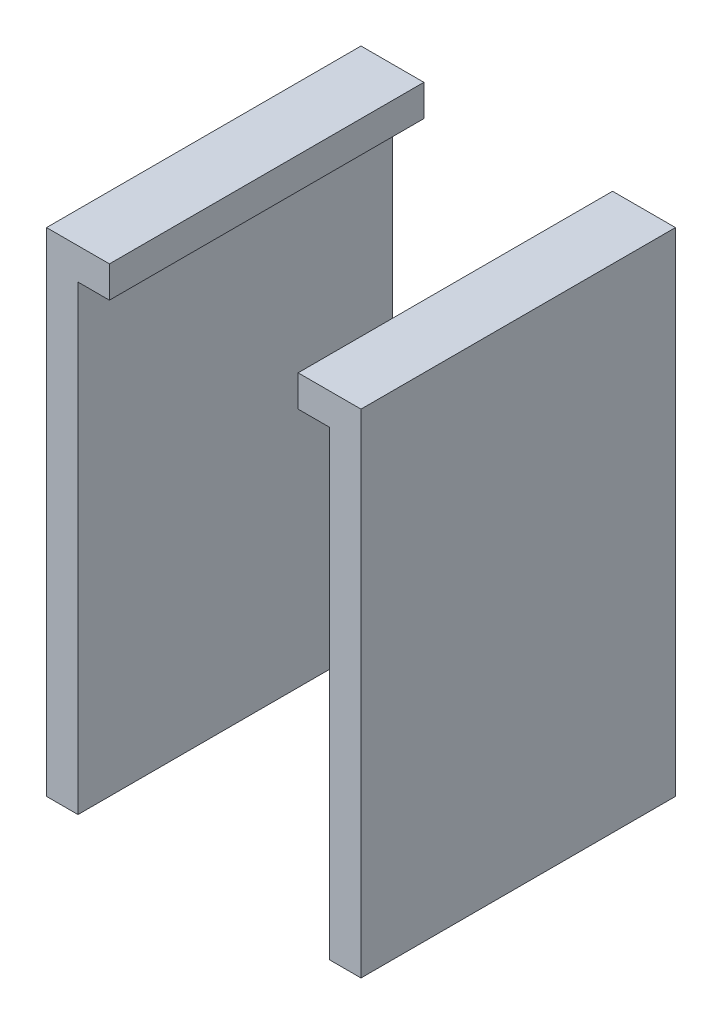
ISO-10303-21;
HEADER;
FILE_DESCRIPTION(('STEP AP214'),'2;1');
FILE_NAME('part.step','',(''),(''),'','','');
FILE_SCHEMA(('AUTOMOTIVE_DESIGN { 1 0 10303 214 1 1 1 1 }'));
ENDSEC;
DATA;
#1=APPLICATION_CONTEXT('core data for automotive mechanical design processes');
#2=APPLICATION_PROTOCOL_DEFINITION('international standard','automotive_design',2000,#1);
#3=PRODUCT_CONTEXT('',#1,'mechanical');
#4=PRODUCT('Part','Part','',(#3));
#5=PRODUCT_RELATED_PRODUCT_CATEGORY('part','',(#4));
#6=PRODUCT_DEFINITION_FORMATION('','',#4);
#7=PRODUCT_DEFINITION_CONTEXT('part definition',#1,'design');
#8=PRODUCT_DEFINITION('design','',#6,#7);
#9=PRODUCT_DEFINITION_SHAPE('','',#8);
#10=(LENGTH_UNIT() NAMED_UNIT(*) SI_UNIT(.MILLI.,.METRE.));
#11=(NAMED_UNIT(*) PLANE_ANGLE_UNIT() SI_UNIT($,.RADIAN.));
#12=(NAMED_UNIT(*) SI_UNIT($,.STERADIAN.) SOLID_ANGLE_UNIT());
#13=UNCERTAINTY_MEASURE_WITH_UNIT(LENGTH_MEASURE(1.E-05),#10,'distance_accuracy_value','');
#14=(GEOMETRIC_REPRESENTATION_CONTEXT(3) GLOBAL_UNCERTAINTY_ASSIGNED_CONTEXT((#13)) GLOBAL_UNIT_ASSIGNED_CONTEXT((#10,
#11,#12)) REPRESENTATION_CONTEXT('',''));
#15=CARTESIAN_POINT('',(0.,0.,0.));
#16=DIRECTION('',(0.,0.,1.));
#17=DIRECTION('',(1.,0.,0.));
#18=AXIS2_PLACEMENT_3D('',#15,#16,#17);
#19=CARTESIAN_POINT('',(150.,0.,150.));
#20=DIRECTION('',(0.,1.,0.));
#21=DIRECTION('',(-1.,0.,0.));
#22=AXIS2_PLACEMENT_3D('',#19,#20,#21);
#23=PLANE('',#22);
#24=DIRECTION('',(1.,0.,0.));
#25=VECTOR('',#24,1.);
#26=CARTESIAN_POINT('',(150.,0.,0.));
#27=LINE('',#26,#25);
#28=CARTESIAN_POINT('',(135.,0.,0.));
#29=VERTEX_POINT('',#28);
#30=CARTESIAN_POINT('',(150.,0.,0.));
#31=VERTEX_POINT('',#30);
#32=EDGE_CURVE('E12',#29,#31,#27,.T.);
#33=ORIENTED_EDGE('',*,*,#32,.T.);
#34=DIRECTION('',(0.,0.,-1.));
#35=VECTOR('',#34,1.);
#36=CARTESIAN_POINT('',(150.,0.,150.));
#37=LINE('',#36,#35);
#38=CARTESIAN_POINT('',(150.,0.,150.));
#39=VERTEX_POINT('',#38);
#40=EDGE_CURVE('E149',#39,#31,#37,.T.);
#41=ORIENTED_EDGE('',*,*,#40,.F.);
#42=DIRECTION('',(1.,0.,0.));
#43=VECTOR('',#42,1.);
#44=CARTESIAN_POINT('',(150.,0.,150.));
#45=LINE('',#44,#43);
#46=CARTESIAN_POINT('',(135.,0.,150.));
#47=VERTEX_POINT('',#46);
#48=EDGE_CURVE('E51',#47,#39,#45,.T.);
#49=ORIENTED_EDGE('',*,*,#48,.F.);
#50=DIRECTION('',(0.,0.,-1.));
#51=VECTOR('',#50,1.);
#52=CARTESIAN_POINT('',(135.,0.,150.));
#53=LINE('',#52,#51);
#54=EDGE_CURVE('E137',#47,#29,#53,.T.);
#55=ORIENTED_EDGE('',*,*,#54,.T.);
#56=EDGE_LOOP('',(#33,#41,#49,#55));
#57=FACE_BOUND('',#56,.T.);
#58=ADVANCED_FACE('F47',(#57),#23,.F.);
#59=CARTESIAN_POINT('',(150.,235.,150.));
#60=DIRECTION('',(-1.,0.,0.));
#61=DIRECTION('',(0.,-1.,0.));
#62=AXIS2_PLACEMENT_3D('',#59,#60,#61);
#63=PLANE('',#62);
#64=DIRECTION('',(0.,1.,0.));
#65=VECTOR('',#64,1.);
#66=CARTESIAN_POINT('',(150.,235.,0.));
#67=LINE('',#66,#65);
#68=CARTESIAN_POINT('',(150.,235.,0.));
#69=VERTEX_POINT('',#68);
#70=EDGE_CURVE('E57',#31,#69,#67,.T.);
#71=ORIENTED_EDGE('',*,*,#70,.T.);
#72=DIRECTION('',(0.,0.,-1.));
#73=VECTOR('',#72,1.);
#74=CARTESIAN_POINT('',(150.,235.,150.));
#75=LINE('',#74,#73);
#76=CARTESIAN_POINT('',(150.,235.,150.));
#77=VERTEX_POINT('',#76);
#78=EDGE_CURVE('E115',#77,#69,#75,.T.);
#79=ORIENTED_EDGE('',*,*,#78,.F.);
#80=DIRECTION('',(0.,1.,0.));
#81=VECTOR('',#80,1.);
#82=CARTESIAN_POINT('',(150.,235.,150.));
#83=LINE('',#82,#81);
#84=EDGE_CURVE('E87',#39,#77,#83,.T.);
#85=ORIENTED_EDGE('',*,*,#84,.F.);
#86=ORIENTED_EDGE('',*,*,#40,.T.);
#87=EDGE_LOOP('',(#71,#79,#85,#86));
#88=FACE_BOUND('',#87,.T.);
#89=ADVANCED_FACE('F150',(#88),#63,.F.);
#90=CARTESIAN_POINT('',(120.,235.,150.));
#91=DIRECTION('',(0.,-1.,0.));
#92=DIRECTION('',(0.,0.,-1.));
#93=AXIS2_PLACEMENT_3D('',#90,#91,#92);
#94=PLANE('',#93);
#95=DIRECTION('',(-1.,0.,0.));
#96=VECTOR('',#95,1.);
#97=CARTESIAN_POINT('',(120.,235.,0.));
#98=LINE('',#97,#96);
#99=CARTESIAN_POINT('',(120.,235.,0.));
#100=VERTEX_POINT('',#99);
#101=EDGE_CURVE('E109',#69,#100,#98,.T.);
#102=ORIENTED_EDGE('',*,*,#101,.T.);
#103=DIRECTION('',(0.,0.,-1.));
#104=VECTOR('',#103,1.);
#105=CARTESIAN_POINT('',(120.,235.,150.));
#106=LINE('',#105,#104);
#107=CARTESIAN_POINT('',(120.,235.,150.));
#108=VERTEX_POINT('',#107);
#109=EDGE_CURVE('E113',#108,#100,#106,.T.);
#110=ORIENTED_EDGE('',*,*,#109,.F.);
#111=DIRECTION('',(-1.,0.,0.));
#112=VECTOR('',#111,1.);
#113=CARTESIAN_POINT('',(120.,235.,150.));
#114=LINE('',#113,#112);
#115=EDGE_CURVE('E140',#77,#108,#114,.T.);
#116=ORIENTED_EDGE('',*,*,#115,.F.);
#117=ORIENTED_EDGE('',*,*,#78,.T.);
#118=EDGE_LOOP('',(#102,#110,#116,#117));
#119=FACE_BOUND('',#118,.T.);
#120=ADVANCED_FACE('F111',(#119),#94,.F.);
#121=CARTESIAN_POINT('',(120.,220.,150.));
#122=DIRECTION('',(1.,0.,0.));
#123=DIRECTION('',(0.,1.,0.));
#124=AXIS2_PLACEMENT_3D('',#121,#122,#123);
#125=PLANE('',#124);
#126=DIRECTION('',(0.,-1.,0.));
#127=VECTOR('',#126,1.);
#128=CARTESIAN_POINT('',(120.,220.,0.));
#129=LINE('',#128,#127);
#130=CARTESIAN_POINT('',(120.,220.,0.));
#131=VERTEX_POINT('',#130);
#132=EDGE_CURVE('E117',#100,#131,#129,.T.);
#133=ORIENTED_EDGE('',*,*,#132,.T.);
#134=DIRECTION('',(0.,0.,-1.));
#135=VECTOR('',#134,1.);
#136=CARTESIAN_POINT('',(120.,220.,150.));
#137=LINE('',#136,#135);
#138=CARTESIAN_POINT('',(120.,220.,150.));
#139=VERTEX_POINT('',#138);
#140=EDGE_CURVE('E124',#139,#131,#137,.T.);
#141=ORIENTED_EDGE('',*,*,#140,.F.);
#142=DIRECTION('',(0.,-1.,0.));
#143=VECTOR('',#142,1.);
#144=CARTESIAN_POINT('',(120.,220.,150.));
#145=LINE('',#144,#143);
#146=EDGE_CURVE('E123',#108,#139,#145,.T.);
#147=ORIENTED_EDGE('',*,*,#146,.F.);
#148=ORIENTED_EDGE('',*,*,#109,.T.);
#149=EDGE_LOOP('',(#133,#141,#147,#148));
#150=FACE_BOUND('',#149,.T.);
#151=ADVANCED_FACE('F120',(#150),#125,.F.);
#152=CARTESIAN_POINT('',(135.,220.,150.));
#153=DIRECTION('',(0.,1.,0.));
#154=DIRECTION('',(-1.,0.,0.));
#155=AXIS2_PLACEMENT_3D('',#152,#153,#154);
#156=PLANE('',#155);
#157=DIRECTION('',(1.,0.,0.));
#158=VECTOR('',#157,1.);
#159=CARTESIAN_POINT('',(135.,220.,0.));
#160=LINE('',#159,#158);
#161=CARTESIAN_POINT('',(135.,220.,0.));
#162=VERTEX_POINT('',#161);
#163=EDGE_CURVE('E128',#131,#162,#160,.T.);
#164=ORIENTED_EDGE('',*,*,#163,.T.);
#165=DIRECTION('',(0.,0.,-1.));
#166=VECTOR('',#165,1.);
#167=CARTESIAN_POINT('',(135.,220.,150.));
#168=LINE('',#167,#166);
#169=CARTESIAN_POINT('',(135.,220.,150.));
#170=VERTEX_POINT('',#169);
#171=EDGE_CURVE('E145',#170,#162,#168,.T.);
#172=ORIENTED_EDGE('',*,*,#171,.F.);
#173=DIRECTION('',(1.,0.,0.));
#174=VECTOR('',#173,1.);
#175=CARTESIAN_POINT('',(135.,220.,150.));
#176=LINE('',#175,#174);
#177=EDGE_CURVE('E136',#139,#170,#176,.T.);
#178=ORIENTED_EDGE('',*,*,#177,.F.);
#179=ORIENTED_EDGE('',*,*,#140,.T.);
#180=EDGE_LOOP('',(#164,#172,#178,#179));
#181=FACE_BOUND('',#180,.T.);
#182=ADVANCED_FACE('F157',(#181),#156,.F.);
#183=CARTESIAN_POINT('',(135.,0.,150.));
#184=DIRECTION('',(1.,0.,0.));
#185=DIRECTION('',(0.,0.,-1.));
#186=AXIS2_PLACEMENT_3D('',#183,#184,#185);
#187=PLANE('',#186);
#188=DIRECTION('',(0.,-1.,0.));
#189=VECTOR('',#188,1.);
#190=CARTESIAN_POINT('',(135.,0.,0.));
#191=LINE('',#190,#189);
#192=EDGE_CURVE('E98',#162,#29,#191,.T.);
#193=ORIENTED_EDGE('',*,*,#192,.T.);
#194=ORIENTED_EDGE('',*,*,#54,.F.);
#195=DIRECTION('',(0.,-1.,0.));
#196=VECTOR('',#195,1.);
#197=CARTESIAN_POINT('',(135.,0.,150.));
#198=LINE('',#197,#196);
#199=EDGE_CURVE('E134',#170,#47,#198,.T.);
#200=ORIENTED_EDGE('',*,*,#199,.F.);
#201=ORIENTED_EDGE('',*,*,#171,.T.);
#202=EDGE_LOOP('',(#193,#194,#200,#201));
#203=FACE_BOUND('',#202,.T.);
#204=ADVANCED_FACE('F153',(#203),#187,.F.);
#205=CARTESIAN_POINT('',(0.,0.,150.));
#206=DIRECTION('',(0.,0.,-1.));
#207=DIRECTION('',(-1.,0.,0.));
#208=AXIS2_PLACEMENT_3D('',#205,#206,#207);
#209=PLANE('',#208);
#210=ORIENTED_EDGE('',*,*,#48,.T.);
#211=ORIENTED_EDGE('',*,*,#84,.T.);
#212=ORIENTED_EDGE('',*,*,#115,.T.);
#213=ORIENTED_EDGE('',*,*,#146,.T.);
#214=ORIENTED_EDGE('',*,*,#177,.T.);
#215=ORIENTED_EDGE('',*,*,#199,.T.);
#216=EDGE_LOOP('',(#210,#211,#212,#213,#214,#215));
#217=FACE_BOUND('',#216,.T.);
#218=ADVANCED_FACE('F49',(#217),#209,.F.);
#219=CARTESIAN_POINT('',(0.,0.,0.));
#220=DIRECTION('',(0.,0.,-1.));
#221=DIRECTION('',(-1.,0.,0.));
#222=AXIS2_PLACEMENT_3D('',#219,#220,#221);
#223=PLANE('',#222);
#224=ORIENTED_EDGE('',*,*,#32,.F.);
#225=ORIENTED_EDGE('',*,*,#192,.F.);
#226=ORIENTED_EDGE('',*,*,#163,.F.);
#227=ORIENTED_EDGE('',*,*,#132,.F.);
#228=ORIENTED_EDGE('',*,*,#101,.F.);
#229=ORIENTED_EDGE('',*,*,#70,.F.);
#230=EDGE_LOOP('',(#224,#225,#226,#227,#228,#229));
#231=FACE_BOUND('',#230,.T.);
#232=ADVANCED_FACE('F127',(#231),#223,.T.);
#233=CLOSED_SHELL('',(#58,#89,#120,#151,#182,#204,#218,#232));
#234=MANIFOLD_SOLID_BREP('B2',#233);
#235=CARTESIAN_POINT('',(15.,0.,150.));
#236=DIRECTION('',(0.,1.,0.));
#237=DIRECTION('',(-1.,0.,0.));
#238=AXIS2_PLACEMENT_3D('',#235,#236,#237);
#239=PLANE('',#238);
#240=DIRECTION('',(1.,0.,0.));
#241=VECTOR('',#240,1.);
#242=CARTESIAN_POINT('',(15.,0.,0.));
#243=LINE('',#242,#241);
#244=CARTESIAN_POINT('',(0.,0.,0.));
#245=VERTEX_POINT('',#244);
#246=CARTESIAN_POINT('',(15.,0.,0.));
#247=VERTEX_POINT('',#246);
#248=EDGE_CURVE('E323',#245,#247,#243,.T.);
#249=ORIENTED_EDGE('',*,*,#248,.T.);
#250=DIRECTION('',(0.,0.,-1.));
#251=VECTOR('',#250,1.);
#252=CARTESIAN_POINT('',(15.,0.,150.));
#253=LINE('',#252,#251);
#254=CARTESIAN_POINT('',(15.,0.,150.));
#255=VERTEX_POINT('',#254);
#256=EDGE_CURVE('E45',#255,#247,#253,.T.);
#257=ORIENTED_EDGE('',*,*,#256,.F.);
#258=DIRECTION('',(1.,0.,0.));
#259=VECTOR('',#258,1.);
#260=CARTESIAN_POINT('',(15.,0.,150.));
#261=LINE('',#260,#259);
#262=CARTESIAN_POINT('',(0.,0.,150.));
#263=VERTEX_POINT('',#262);
#264=EDGE_CURVE('E333',#263,#255,#261,.T.);
#265=ORIENTED_EDGE('',*,*,#264,.F.);
#266=DIRECTION('',(0.,0.,-1.));
#267=VECTOR('',#266,1.);
#268=CARTESIAN_POINT('',(0.,0.,150.));
#269=LINE('',#268,#267);
#270=EDGE_CURVE('E319',#263,#245,#269,.T.);
#271=ORIENTED_EDGE('',*,*,#270,.T.);
#272=EDGE_LOOP('',(#249,#257,#265,#271));
#273=FACE_BOUND('',#272,.T.);
#274=ADVANCED_FACE('F239',(#273),#239,.F.);
#275=CARTESIAN_POINT('',(15.,220.,150.));
#276=DIRECTION('',(-1.,0.,0.));
#277=DIRECTION('',(0.,-1.,0.));
#278=AXIS2_PLACEMENT_3D('',#275,#276,#277);
#279=PLANE('',#278);
#280=DIRECTION('',(0.,1.,0.));
#281=VECTOR('',#280,1.);
#282=CARTESIAN_POINT('',(15.,220.,0.));
#283=LINE('',#282,#281);
#284=CARTESIAN_POINT('',(15.,220.,0.));
#285=VERTEX_POINT('',#284);
#286=EDGE_CURVE('E326',#247,#285,#283,.T.);
#287=ORIENTED_EDGE('',*,*,#286,.T.);
#288=DIRECTION('',(0.,0.,-1.));
#289=VECTOR('',#288,1.);
#290=CARTESIAN_POINT('',(15.,220.,150.));
#291=LINE('',#290,#289);
#292=CARTESIAN_POINT('',(15.,220.,150.));
#293=VERTEX_POINT('',#292);
#294=EDGE_CURVE('E247',#293,#285,#291,.T.);
#295=ORIENTED_EDGE('',*,*,#294,.F.);
#296=DIRECTION('',(0.,1.,0.));
#297=VECTOR('',#296,1.);
#298=CARTESIAN_POINT('',(15.,220.,150.));
#299=LINE('',#298,#297);
#300=EDGE_CURVE('E292',#255,#293,#299,.T.);
#301=ORIENTED_EDGE('',*,*,#300,.F.);
#302=ORIENTED_EDGE('',*,*,#256,.T.);
#303=EDGE_LOOP('',(#287,#295,#301,#302));
#304=FACE_BOUND('',#303,.T.);
#305=ADVANCED_FACE('F357',(#304),#279,.F.);
#306=CARTESIAN_POINT('',(30.,220.,150.));
#307=DIRECTION('',(0.,1.,0.));
#308=DIRECTION('',(-1.,0.,0.));
#309=AXIS2_PLACEMENT_3D('',#306,#307,#308);
#310=PLANE('',#309);
#311=DIRECTION('',(1.,0.,0.));
#312=VECTOR('',#311,1.);
#313=CARTESIAN_POINT('',(30.,220.,0.));
#314=LINE('',#313,#312);
#315=CARTESIAN_POINT('',(30.,220.,0.));
#316=VERTEX_POINT('',#315);
#317=EDGE_CURVE('E328',#285,#316,#314,.T.);
#318=ORIENTED_EDGE('',*,*,#317,.T.);
#319=DIRECTION('',(0.,0.,-1.));
#320=VECTOR('',#319,1.);
#321=CARTESIAN_POINT('',(30.,220.,150.));
#322=LINE('',#321,#320);
#323=CARTESIAN_POINT('',(30.,220.,150.));
#324=VERTEX_POINT('',#323);
#325=EDGE_CURVE('E314',#324,#316,#322,.T.);
#326=ORIENTED_EDGE('',*,*,#325,.F.);
#327=DIRECTION('',(1.,0.,0.));
#328=VECTOR('',#327,1.);
#329=CARTESIAN_POINT('',(30.,220.,150.));
#330=LINE('',#329,#328);
#331=EDGE_CURVE('E305',#293,#324,#330,.T.);
#332=ORIENTED_EDGE('',*,*,#331,.F.);
#333=ORIENTED_EDGE('',*,*,#294,.T.);
#334=EDGE_LOOP('',(#318,#326,#332,#333));
#335=FACE_BOUND('',#334,.T.);
#336=ADVANCED_FACE('F339',(#335),#310,.F.);
#337=CARTESIAN_POINT('',(30.,235.,150.));
#338=DIRECTION('',(-1.,0.,0.));
#339=DIRECTION('',(0.,-1.,0.));
#340=AXIS2_PLACEMENT_3D('',#337,#338,#339);
#341=PLANE('',#340);
#342=DIRECTION('',(0.,1.,0.));
#343=VECTOR('',#342,1.);
#344=CARTESIAN_POINT('',(30.,235.,0.));
#345=LINE('',#344,#343);
#346=CARTESIAN_POINT('',(30.,235.,0.));
#347=VERTEX_POINT('',#346);
#348=EDGE_CURVE('E313',#316,#347,#345,.T.);
#349=ORIENTED_EDGE('',*,*,#348,.T.);
#350=DIRECTION('',(0.,0.,-1.));
#351=VECTOR('',#350,1.);
#352=CARTESIAN_POINT('',(30.,235.,150.));
#353=LINE('',#352,#351);
#354=CARTESIAN_POINT('',(30.,235.,150.));
#355=VERTEX_POINT('',#354);
#356=EDGE_CURVE('E310',#355,#347,#353,.T.);
#357=ORIENTED_EDGE('',*,*,#356,.F.);
#358=DIRECTION('',(0.,1.,0.));
#359=VECTOR('',#358,1.);
#360=CARTESIAN_POINT('',(30.,235.,150.));
#361=LINE('',#360,#359);
#362=EDGE_CURVE('E299',#324,#355,#361,.T.);
#363=ORIENTED_EDGE('',*,*,#362,.F.);
#364=ORIENTED_EDGE('',*,*,#325,.T.);
#365=EDGE_LOOP('',(#349,#357,#363,#364));
#366=FACE_BOUND('',#365,.T.);
#367=ADVANCED_FACE('F311',(#366),#341,.F.);
#368=CARTESIAN_POINT('',(0.,235.,150.));
#369=DIRECTION('',(0.,-1.,0.));
#370=DIRECTION('',(1.,0.,0.));
#371=AXIS2_PLACEMENT_3D('',#368,#369,#370);
#372=PLANE('',#371);
#373=DIRECTION('',(-1.,0.,0.));
#374=VECTOR('',#373,1.);
#375=CARTESIAN_POINT('',(0.,235.,0.));
#376=LINE('',#375,#374);
#377=CARTESIAN_POINT('',(0.,235.,0.));
#378=VERTEX_POINT('',#377);
#379=EDGE_CURVE('E278',#347,#378,#376,.T.);
#380=ORIENTED_EDGE('',*,*,#379,.T.);
#381=DIRECTION('',(0.,0.,-1.));
#382=VECTOR('',#381,1.);
#383=CARTESIAN_POINT('',(0.,235.,150.));
#384=LINE('',#383,#382);
#385=CARTESIAN_POINT('',(0.,235.,150.));
#386=VERTEX_POINT('',#385);
#387=EDGE_CURVE('E315',#386,#378,#384,.T.);
#388=ORIENTED_EDGE('',*,*,#387,.F.);
#389=DIRECTION('',(-1.,0.,0.));
#390=VECTOR('',#389,1.);
#391=CARTESIAN_POINT('',(0.,235.,150.));
#392=LINE('',#391,#390);
#393=EDGE_CURVE('E303',#355,#386,#392,.T.);
#394=ORIENTED_EDGE('',*,*,#393,.F.);
#395=ORIENTED_EDGE('',*,*,#356,.T.);
#396=EDGE_LOOP('',(#380,#388,#394,#395));
#397=FACE_BOUND('',#396,.T.);
#398=ADVANCED_FACE('F317',(#397),#372,.F.);
#399=CARTESIAN_POINT('',(0.,0.,150.));
#400=DIRECTION('',(1.,0.,0.));
#401=DIRECTION('',(0.,1.,0.));
#402=AXIS2_PLACEMENT_3D('',#399,#400,#401);
#403=PLANE('',#402);
#404=DIRECTION('',(0.,-1.,0.));
#405=VECTOR('',#404,1.);
#406=CARTESIAN_POINT('',(0.,0.,0.));
#407=LINE('',#406,#405);
#408=EDGE_CURVE('E284',#378,#245,#407,.T.);
#409=ORIENTED_EDGE('',*,*,#408,.T.);
#410=ORIENTED_EDGE('',*,*,#270,.F.);
#411=DIRECTION('',(0.,-1.,0.));
#412=VECTOR('',#411,1.);
#413=CARTESIAN_POINT('',(0.,0.,150.));
#414=LINE('',#413,#412);
#415=EDGE_CURVE('E255',#386,#263,#414,.T.);
#416=ORIENTED_EDGE('',*,*,#415,.F.);
#417=ORIENTED_EDGE('',*,*,#387,.T.);
#418=EDGE_LOOP('',(#409,#410,#416,#417));
#419=FACE_BOUND('',#418,.T.);
#420=ADVANCED_FACE('F346',(#419),#403,.F.);
#421=CARTESIAN_POINT('',(0.,0.,150.));
#422=DIRECTION('',(0.,0.,-1.));
#423=DIRECTION('',(-1.,0.,0.));
#424=AXIS2_PLACEMENT_3D('',#421,#422,#423);
#425=PLANE('',#424);
#426=ORIENTED_EDGE('',*,*,#264,.T.);
#427=ORIENTED_EDGE('',*,*,#300,.T.);
#428=ORIENTED_EDGE('',*,*,#331,.T.);
#429=ORIENTED_EDGE('',*,*,#362,.T.);
#430=ORIENTED_EDGE('',*,*,#393,.T.);
#431=ORIENTED_EDGE('',*,*,#415,.T.);
#432=EDGE_LOOP('',(#426,#427,#428,#429,#430,#431));
#433=FACE_BOUND('',#432,.T.);
#434=ADVANCED_FACE('F301',(#433),#425,.F.);
#435=CARTESIAN_POINT('',(0.,0.,0.));
#436=DIRECTION('',(0.,0.,-1.));
#437=DIRECTION('',(-1.,0.,0.));
#438=AXIS2_PLACEMENT_3D('',#435,#436,#437);
#439=PLANE('',#438);
#440=ORIENTED_EDGE('',*,*,#248,.F.);
#441=ORIENTED_EDGE('',*,*,#408,.F.);
#442=ORIENTED_EDGE('',*,*,#379,.F.);
#443=ORIENTED_EDGE('',*,*,#348,.F.);
#444=ORIENTED_EDGE('',*,*,#317,.F.);
#445=ORIENTED_EDGE('',*,*,#286,.F.);
#446=EDGE_LOOP('',(#440,#441,#442,#443,#444,#445));
#447=FACE_BOUND('',#446,.T.);
#448=ADVANCED_FACE('F342',(#447),#439,.T.);
#449=CLOSED_SHELL('',(#274,#305,#336,#367,#398,#420,#434,#448));
#450=MANIFOLD_SOLID_BREP('B6',#449);
#451=ADVANCED_BREP_SHAPE_REPRESENTATION('',(#18,#234,#450),#14);
#452=SHAPE_DEFINITION_REPRESENTATION(#9,#451);
ENDSEC;
END-ISO-10303-21;
